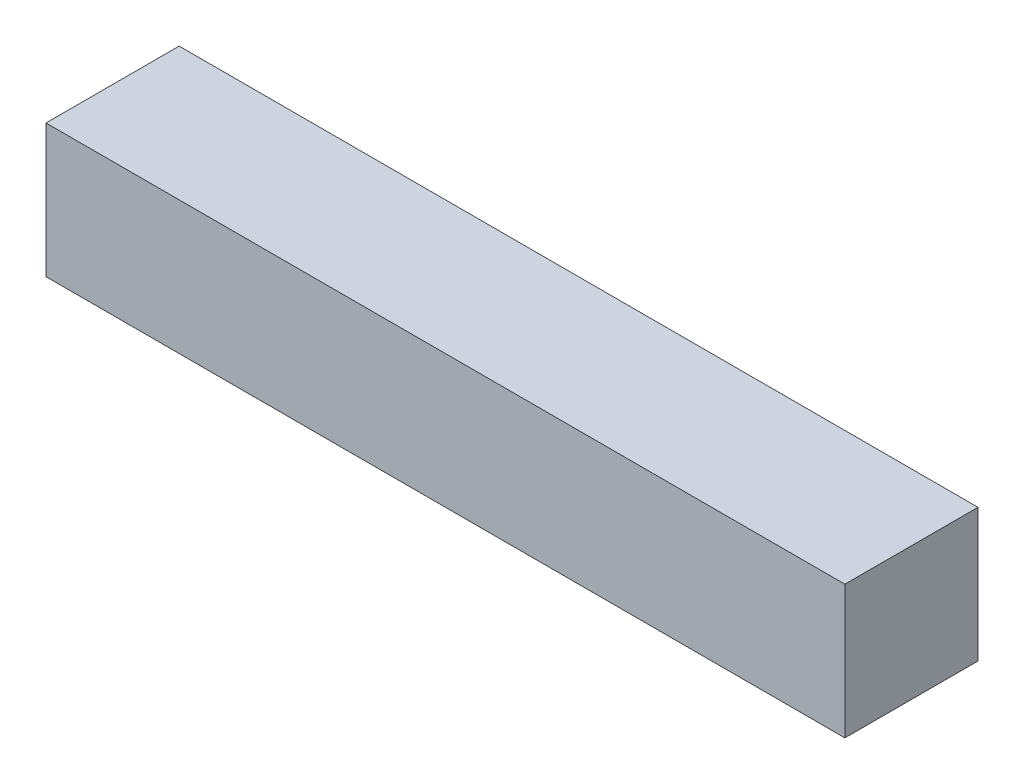
ISO-10303-21;
HEADER;
FILE_DESCRIPTION(('STEP AP214'),'2;1');
FILE_NAME('part.step','',(''),(''),'','','');
FILE_SCHEMA(('AUTOMOTIVE_DESIGN { 1 0 10303 214 1 1 1 1 }'));
ENDSEC;
DATA;
#1=APPLICATION_CONTEXT('core data for automotive mechanical design processes');
#2=APPLICATION_PROTOCOL_DEFINITION('international standard','automotive_design',2000,#1);
#3=PRODUCT_CONTEXT('',#1,'mechanical');
#4=PRODUCT('Part','Part','',(#3));
#5=PRODUCT_RELATED_PRODUCT_CATEGORY('part','',(#4));
#6=PRODUCT_DEFINITION_FORMATION('','',#4);
#7=PRODUCT_DEFINITION_CONTEXT('part definition',#1,'design');
#8=PRODUCT_DEFINITION('design','',#6,#7);
#9=PRODUCT_DEFINITION_SHAPE('','',#8);
#10=(LENGTH_UNIT() NAMED_UNIT(*) SI_UNIT(.MILLI.,.METRE.));
#11=(NAMED_UNIT(*) PLANE_ANGLE_UNIT() SI_UNIT($,.RADIAN.));
#12=(NAMED_UNIT(*) SI_UNIT($,.STERADIAN.) SOLID_ANGLE_UNIT());
#13=UNCERTAINTY_MEASURE_WITH_UNIT(LENGTH_MEASURE(1.E-05),#10,'distance_accuracy_value','');
#14=(GEOMETRIC_REPRESENTATION_CONTEXT(3) GLOBAL_UNCERTAINTY_ASSIGNED_CONTEXT((#13)) GLOBAL_UNIT_ASSIGNED_CONTEXT((#10,
#11,#12)) REPRESENTATION_CONTEXT('',''));
#15=CARTESIAN_POINT('',(0.,0.,0.));
#16=DIRECTION('',(0.,0.,1.));
#17=DIRECTION('',(1.,0.,0.));
#18=AXIS2_PLACEMENT_3D('',#15,#16,#17);
#19=CARTESIAN_POINT('',(9.,-1.5,3.));
#20=DIRECTION('',(-1.,0.,0.));
#21=DIRECTION('',(0.,0.,1.));
#22=AXIS2_PLACEMENT_3D('',#19,#20,#21);
#23=PLANE('',#22);
#24=DIRECTION('',(0.,1.,0.));
#25=VECTOR('',#24,1.);
#26=CARTESIAN_POINT('',(9.,-1.5,0.));
#27=LINE('',#26,#25);
#28=CARTESIAN_POINT('',(9.,-1.5,0.));
#29=VERTEX_POINT('',#28);
#30=CARTESIAN_POINT('',(9.,1.5,0.));
#31=VERTEX_POINT('',#30);
#32=EDGE_CURVE('E97',#29,#31,#27,.T.);
#33=ORIENTED_EDGE('',*,*,#32,.T.);
#34=DIRECTION('',(0.,0.,-1.));
#35=VECTOR('',#34,1.);
#36=CARTESIAN_POINT('',(9.,1.5,3.));
#37=LINE('',#36,#35);
#38=CARTESIAN_POINT('',(9.,1.5,3.));
#39=VERTEX_POINT('',#38);
#40=EDGE_CURVE('E11',#39,#31,#37,.T.);
#41=ORIENTED_EDGE('',*,*,#40,.F.);
#42=DIRECTION('',(0.,1.,0.));
#43=VECTOR('',#42,1.);
#44=CARTESIAN_POINT('',(9.,-1.5,3.));
#45=LINE('',#44,#43);
#46=CARTESIAN_POINT('',(9.,-1.5,3.));
#47=VERTEX_POINT('',#46);
#48=EDGE_CURVE('E85',#47,#39,#45,.T.);
#49=ORIENTED_EDGE('',*,*,#48,.F.);
#50=DIRECTION('',(0.,0.,-1.));
#51=VECTOR('',#50,1.);
#52=CARTESIAN_POINT('',(9.,-1.5,3.));
#53=LINE('',#52,#51);
#54=EDGE_CURVE('E93',#47,#29,#53,.T.);
#55=ORIENTED_EDGE('',*,*,#54,.T.);
#56=EDGE_LOOP('',(#33,#41,#49,#55));
#57=FACE_BOUND('',#56,.T.);
#58=ADVANCED_FACE('F34',(#57),#23,.F.);
#59=CARTESIAN_POINT('',(-9.,1.5,3.));
#60=DIRECTION('',(0.,-1.,0.));
#61=DIRECTION('',(0.,0.,-1.));
#62=AXIS2_PLACEMENT_3D('',#59,#60,#61);
#63=PLANE('',#62);
#64=DIRECTION('',(-1.,0.,0.));
#65=VECTOR('',#64,1.);
#66=CARTESIAN_POINT('',(-9.,1.5,0.));
#67=LINE('',#66,#65);
#68=CARTESIAN_POINT('',(-9.,1.5,0.));
#69=VERTEX_POINT('',#68);
#70=EDGE_CURVE('E89',#31,#69,#67,.T.);
#71=ORIENTED_EDGE('',*,*,#70,.T.);
#72=DIRECTION('',(0.,0.,-1.));
#73=VECTOR('',#72,1.);
#74=CARTESIAN_POINT('',(-9.,1.5,3.));
#75=LINE('',#74,#73);
#76=CARTESIAN_POINT('',(-9.,1.5,3.));
#77=VERTEX_POINT('',#76);
#78=EDGE_CURVE('E42',#77,#69,#75,.T.);
#79=ORIENTED_EDGE('',*,*,#78,.F.);
#80=DIRECTION('',(-1.,0.,0.));
#81=VECTOR('',#80,1.);
#82=CARTESIAN_POINT('',(-9.,1.5,3.));
#83=LINE('',#82,#81);
#84=EDGE_CURVE('E80',#39,#77,#83,.T.);
#85=ORIENTED_EDGE('',*,*,#84,.F.);
#86=ORIENTED_EDGE('',*,*,#40,.T.);
#87=EDGE_LOOP('',(#71,#79,#85,#86));
#88=FACE_BOUND('',#87,.T.);
#89=ADVANCED_FACE('F88',(#88),#63,.F.);
#90=CARTESIAN_POINT('',(-9.,-1.5,3.));
#91=DIRECTION('',(1.,0.,0.));
#92=DIRECTION('',(0.,0.,-1.));
#93=AXIS2_PLACEMENT_3D('',#90,#91,#92);
#94=PLANE('',#93);
#95=DIRECTION('',(0.,-1.,0.));
#96=VECTOR('',#95,1.);
#97=CARTESIAN_POINT('',(-9.,-1.5,0.));
#98=LINE('',#97,#96);
#99=CARTESIAN_POINT('',(-9.,-1.5,0.));
#100=VERTEX_POINT('',#99);
#101=EDGE_CURVE('E67',#69,#100,#98,.T.);
#102=ORIENTED_EDGE('',*,*,#101,.T.);
#103=DIRECTION('',(0.,0.,-1.));
#104=VECTOR('',#103,1.);
#105=CARTESIAN_POINT('',(-9.,-1.5,3.));
#106=LINE('',#105,#104);
#107=CARTESIAN_POINT('',(-9.,-1.5,3.));
#108=VERTEX_POINT('',#107);
#109=EDGE_CURVE('E90',#108,#100,#106,.T.);
#110=ORIENTED_EDGE('',*,*,#109,.F.);
#111=DIRECTION('',(0.,-1.,0.));
#112=VECTOR('',#111,1.);
#113=CARTESIAN_POINT('',(-9.,-1.5,3.));
#114=LINE('',#113,#112);
#115=EDGE_CURVE('E83',#77,#108,#114,.T.);
#116=ORIENTED_EDGE('',*,*,#115,.F.);
#117=ORIENTED_EDGE('',*,*,#78,.T.);
#118=EDGE_LOOP('',(#102,#110,#116,#117));
#119=FACE_BOUND('',#118,.T.);
#120=ADVANCED_FACE('F91',(#119),#94,.F.);
#121=CARTESIAN_POINT('',(-9.,-1.5,3.));
#122=DIRECTION('',(0.,1.,0.));
#123=DIRECTION('',(0.,0.,1.));
#124=AXIS2_PLACEMENT_3D('',#121,#122,#123);
#125=PLANE('',#124);
#126=DIRECTION('',(1.,0.,0.));
#127=VECTOR('',#126,1.);
#128=CARTESIAN_POINT('',(-9.,-1.5,0.));
#129=LINE('',#128,#127);
#130=EDGE_CURVE('E73',#100,#29,#129,.T.);
#131=ORIENTED_EDGE('',*,*,#130,.T.);
#132=ORIENTED_EDGE('',*,*,#54,.F.);
#133=DIRECTION('',(1.,0.,0.));
#134=VECTOR('',#133,1.);
#135=CARTESIAN_POINT('',(-9.,-1.5,3.));
#136=LINE('',#135,#134);
#137=EDGE_CURVE('E50',#108,#47,#136,.T.);
#138=ORIENTED_EDGE('',*,*,#137,.F.);
#139=ORIENTED_EDGE('',*,*,#109,.T.);
#140=EDGE_LOOP('',(#131,#132,#138,#139));
#141=FACE_BOUND('',#140,.T.);
#142=ADVANCED_FACE('F104',(#141),#125,.F.);
#143=CARTESIAN_POINT('',(0.,0.,3.));
#144=DIRECTION('',(0.,0.,-1.));
#145=DIRECTION('',(-1.,0.,0.));
#146=AXIS2_PLACEMENT_3D('',#143,#144,#145);
#147=PLANE('',#146);
#148=ORIENTED_EDGE('',*,*,#48,.T.);
#149=ORIENTED_EDGE('',*,*,#84,.T.);
#150=ORIENTED_EDGE('',*,*,#115,.T.);
#151=ORIENTED_EDGE('',*,*,#137,.T.);
#152=EDGE_LOOP('',(#148,#149,#150,#151));
#153=FACE_BOUND('',#152,.T.);
#154=ADVANCED_FACE('F81',(#153),#147,.F.);
#155=CARTESIAN_POINT('',(0.,0.,0.));
#156=DIRECTION('',(0.,0.,-1.));
#157=DIRECTION('',(-1.,0.,0.));
#158=AXIS2_PLACEMENT_3D('',#155,#156,#157);
#159=PLANE('',#158);
#160=ORIENTED_EDGE('',*,*,#32,.F.);
#161=ORIENTED_EDGE('',*,*,#130,.F.);
#162=ORIENTED_EDGE('',*,*,#101,.F.);
#163=ORIENTED_EDGE('',*,*,#70,.F.);
#164=EDGE_LOOP('',(#160,#161,#162,#163));
#165=FACE_BOUND('',#164,.T.);
#166=ADVANCED_FACE('F107',(#165),#159,.T.);
#167=CLOSED_SHELL('',(#58,#89,#120,#142,#154,#166));
#168=MANIFOLD_SOLID_BREP('B2',#167);
#169=ADVANCED_BREP_SHAPE_REPRESENTATION('',(#18,#168),#14);
#170=SHAPE_DEFINITION_REPRESENTATION(#9,#169);
ENDSEC;
END-ISO-10303-21;
